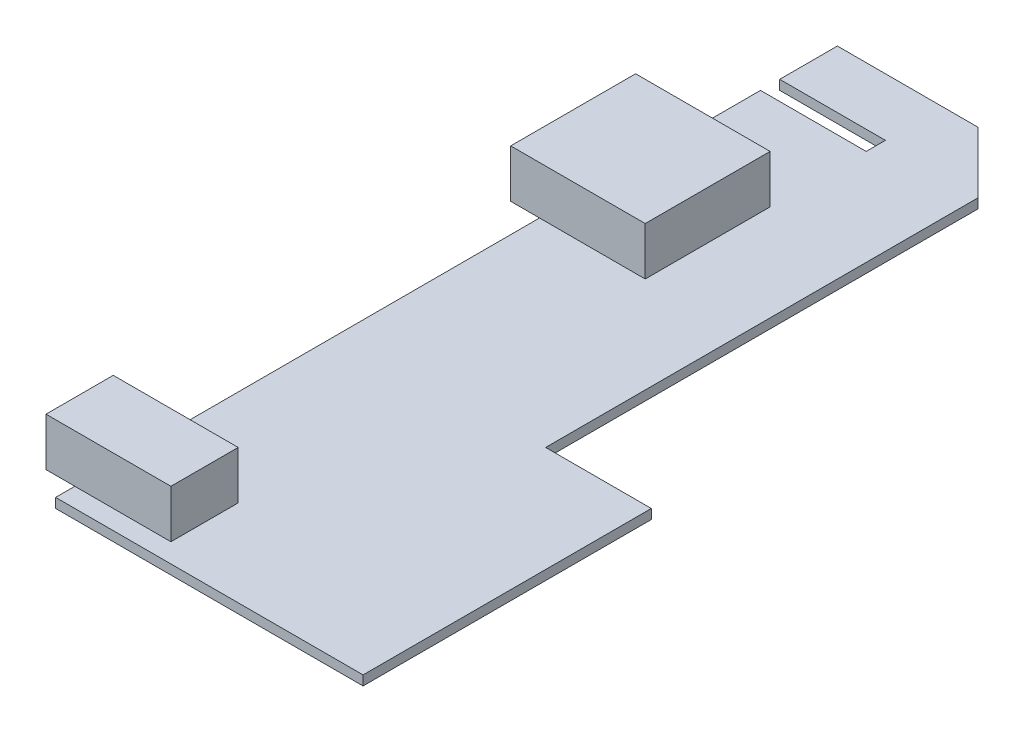
ISO-10303-21;
HEADER;
FILE_DESCRIPTION(('STEP AP214'),'2;1');
FILE_NAME('part.step','',(''),(''),'','','');
FILE_SCHEMA(('AUTOMOTIVE_DESIGN { 1 0 10303 214 1 1 1 1 }'));
ENDSEC;
DATA;
#1=APPLICATION_CONTEXT('core data for automotive mechanical design processes');
#2=APPLICATION_PROTOCOL_DEFINITION('international standard','automotive_design',2000,#1);
#3=PRODUCT_CONTEXT('',#1,'mechanical');
#4=PRODUCT('Part','Part','',(#3));
#5=PRODUCT_RELATED_PRODUCT_CATEGORY('part','',(#4));
#6=PRODUCT_DEFINITION_FORMATION('','',#4);
#7=PRODUCT_DEFINITION_CONTEXT('part definition',#1,'design');
#8=PRODUCT_DEFINITION('design','',#6,#7);
#9=PRODUCT_DEFINITION_SHAPE('','',#8);
#10=(LENGTH_UNIT() NAMED_UNIT(*) SI_UNIT(.MILLI.,.METRE.));
#11=(NAMED_UNIT(*) PLANE_ANGLE_UNIT() SI_UNIT($,.RADIAN.));
#12=(NAMED_UNIT(*) SI_UNIT($,.STERADIAN.) SOLID_ANGLE_UNIT());
#13=UNCERTAINTY_MEASURE_WITH_UNIT(LENGTH_MEASURE(1.E-05),#10,'distance_accuracy_value','');
#14=(GEOMETRIC_REPRESENTATION_CONTEXT(3) GLOBAL_UNCERTAINTY_ASSIGNED_CONTEXT((#13)) GLOBAL_UNIT_ASSIGNED_CONTEXT((#10,
#11,#12)) REPRESENTATION_CONTEXT('',''));
#15=CARTESIAN_POINT('',(0.,0.,0.));
#16=DIRECTION('',(0.,0.,1.));
#17=DIRECTION('',(1.,0.,0.));
#18=AXIS2_PLACEMENT_3D('',#15,#16,#17);
#19=CARTESIAN_POINT('',(0.,1.,0.));
#20=DIRECTION('',(0.,1.,0.));
#21=DIRECTION('',(0.,0.,1.));
#22=AXIS2_PLACEMENT_3D('',#19,#20,#21);
#23=PLANE('',#22);
#24=DIRECTION('',(0.,0.,1.));
#25=VECTOR('',#24,1.);
#26=CARTESIAN_POINT('',(0.,1.,-73.3639610306789));
#27=LINE('',#26,#25);
#28=CARTESIAN_POINT('',(0.,1.,-73.3639610306789));
#29=VERTEX_POINT('',#28);
#30=CARTESIAN_POINT('',(0.,1.,-63.3639610306789));
#31=VERTEX_POINT('',#30);
#32=EDGE_CURVE('E237',#29,#31,#27,.T.);
#33=ORIENTED_EDGE('',*,*,#32,.T.);
#34=DIRECTION('',(-1.,0.,0.));
#35=VECTOR('',#34,1.);
#36=CARTESIAN_POINT('',(-3.00000000000001,1.,-63.3639610306789));
#37=LINE('',#36,#35);
#38=CARTESIAN_POINT('',(11.,1.,-63.3639610306789));
#39=VERTEX_POINT('',#38);
#40=EDGE_CURVE('E434',#39,#31,#37,.T.);
#41=ORIENTED_EDGE('',*,*,#40,.F.);
#42=DIRECTION('',(0.,0.,-1.));
#43=VECTOR('',#42,1.);
#44=CARTESIAN_POINT('',(11.,1.,-50.3639610306789));
#45=LINE('',#44,#43);
#46=CARTESIAN_POINT('',(11.,1.,-50.3639610306789));
#47=VERTEX_POINT('',#46);
#48=EDGE_CURVE('E195',#47,#39,#45,.T.);
#49=ORIENTED_EDGE('',*,*,#48,.F.);
#50=DIRECTION('',(-1.,0.,0.));
#51=VECTOR('',#50,1.);
#52=CARTESIAN_POINT('',(0.,1.,-50.3639610306789));
#53=LINE('',#52,#51);
#54=CARTESIAN_POINT('',(0.,1.,-50.3639610306789));
#55=VERTEX_POINT('',#54);
#56=EDGE_CURVE('E11',#47,#55,#53,.T.);
#57=ORIENTED_EDGE('',*,*,#56,.T.);
#58=CARTESIAN_POINT('',(0.,1.,-9.00000000000001));
#59=VERTEX_POINT('',#58);
#60=EDGE_CURVE('E242',#55,#59,#27,.T.);
#61=ORIENTED_EDGE('',*,*,#60,.T.);
#62=DIRECTION('',(-1.,0.,0.));
#63=VECTOR('',#62,1.);
#64=CARTESIAN_POINT('',(-3.,1.,-9.));
#65=LINE('',#64,#63);
#66=CARTESIAN_POINT('',(10.,1.,-9.));
#67=VERTEX_POINT('',#66);
#68=EDGE_CURVE('E56',#67,#59,#65,.T.);
#69=ORIENTED_EDGE('',*,*,#68,.F.);
#70=DIRECTION('',(0.,0.,-1.));
#71=VECTOR('',#70,1.);
#72=CARTESIAN_POINT('',(10.,1.,-9.));
#73=LINE('',#72,#71);
#74=CARTESIAN_POINT('',(10.,1.,-2.));
#75=VERTEX_POINT('',#74);
#76=EDGE_CURVE('E221',#75,#67,#73,.T.);
#77=ORIENTED_EDGE('',*,*,#76,.F.);
#78=DIRECTION('',(1.,0.,0.));
#79=VECTOR('',#78,1.);
#80=CARTESIAN_POINT('',(10.,1.,-2.));
#81=LINE('',#80,#79);
#82=CARTESIAN_POINT('',(0.,1.,-2.));
#83=VERTEX_POINT('',#82);
#84=EDGE_CURVE('E41',#83,#75,#81,.T.);
#85=ORIENTED_EDGE('',*,*,#84,.F.);
#86=CARTESIAN_POINT('',(0.,1.,0.));
#87=VERTEX_POINT('',#86);
#88=EDGE_CURVE('E286',#83,#87,#27,.T.);
#89=ORIENTED_EDGE('',*,*,#88,.T.);
#90=DIRECTION('',(1.,0.,0.));
#91=VECTOR('',#90,1.);
#92=CARTESIAN_POINT('',(0.,1.,0.));
#93=LINE('',#92,#91);
#94=CARTESIAN_POINT('',(32.,1.,0.));
#95=VERTEX_POINT('',#94);
#96=EDGE_CURVE('E240',#87,#95,#93,.T.);
#97=ORIENTED_EDGE('',*,*,#96,.T.);
#98=DIRECTION('',(0.,0.,-1.));
#99=VECTOR('',#98,1.);
#100=CARTESIAN_POINT('',(32.,1.,0.));
#101=LINE('',#100,#99);
#102=CARTESIAN_POINT('',(32.,1.,-30.));
#103=VERTEX_POINT('',#102);
#104=EDGE_CURVE('E245',#95,#103,#101,.T.);
#105=ORIENTED_EDGE('',*,*,#104,.T.);
#106=DIRECTION('',(-1.,0.,0.));
#107=VECTOR('',#106,1.);
#108=CARTESIAN_POINT('',(32.,1.,-30.));
#109=LINE('',#108,#107);
#110=CARTESIAN_POINT('',(21.,1.,-30.));
#111=VERTEX_POINT('',#110);
#112=EDGE_CURVE('E247',#103,#111,#109,.T.);
#113=ORIENTED_EDGE('',*,*,#112,.T.);
#114=DIRECTION('',(0.,0.,-1.));
#115=VECTOR('',#114,1.);
#116=CARTESIAN_POINT('',(21.,1.,-30.));
#117=LINE('',#116,#115);
#118=CARTESIAN_POINT('',(21.,1.,-75.));
#119=VERTEX_POINT('',#118);
#120=EDGE_CURVE('E249',#111,#119,#117,.T.);
#121=ORIENTED_EDGE('',*,*,#120,.T.);
#122=DIRECTION('',(-0.707106781186548,0.,-0.707106781186547));
#123=VECTOR('',#122,1.);
#124=CARTESIAN_POINT('',(21.,1.,-75.));
#125=LINE('',#124,#123);
#126=CARTESIAN_POINT('',(14.6360389693211,1.,-81.3639610306789));
#127=VERTEX_POINT('',#126);
#128=EDGE_CURVE('E251',#119,#127,#125,.T.);
#129=ORIENTED_EDGE('',*,*,#128,.T.);
#130=DIRECTION('',(-1.,0.,0.));
#131=VECTOR('',#130,1.);
#132=CARTESIAN_POINT('',(14.6360389693211,1.,-81.3639610306789));
#133=LINE('',#132,#131);
#134=CARTESIAN_POINT('',(0.,1.,-81.3639610306789));
#135=VERTEX_POINT('',#134);
#136=EDGE_CURVE('E253',#127,#135,#133,.T.);
#137=ORIENTED_EDGE('',*,*,#136,.T.);
#138=DIRECTION('',(0.,0.,1.));
#139=VECTOR('',#138,1.);
#140=CARTESIAN_POINT('',(0.,1.,-81.3639610306789));
#141=LINE('',#140,#139);
#142=CARTESIAN_POINT('',(0.,1.,-75.3639610306789));
#143=VERTEX_POINT('',#142);
#144=EDGE_CURVE('E255',#135,#143,#141,.T.);
#145=ORIENTED_EDGE('',*,*,#144,.T.);
#146=DIRECTION('',(1.,0.,0.));
#147=VECTOR('',#146,1.);
#148=CARTESIAN_POINT('',(0.,1.,-75.3639610306789));
#149=LINE('',#148,#147);
#150=CARTESIAN_POINT('',(11.,1.,-75.3639610306789));
#151=VERTEX_POINT('',#150);
#152=EDGE_CURVE('E257',#143,#151,#149,.T.);
#153=ORIENTED_EDGE('',*,*,#152,.T.);
#154=DIRECTION('',(0.,0.,1.));
#155=VECTOR('',#154,1.);
#156=CARTESIAN_POINT('',(11.,1.,-75.3639610306789));
#157=LINE('',#156,#155);
#158=CARTESIAN_POINT('',(11.,1.,-73.3639610306789));
#159=VERTEX_POINT('',#158);
#160=EDGE_CURVE('E259',#151,#159,#157,.T.);
#161=ORIENTED_EDGE('',*,*,#160,.T.);
#162=DIRECTION('',(-1.,0.,0.));
#163=VECTOR('',#162,1.);
#164=CARTESIAN_POINT('',(11.,1.,-73.3639610306789));
#165=LINE('',#164,#163);
#166=EDGE_CURVE('E261',#159,#29,#165,.T.);
#167=ORIENTED_EDGE('',*,*,#166,.T.);
#168=EDGE_LOOP('',(#33,#41,#49,#57,#61,#69,#77,#85,#89,#97,#105,#113,#121,#129,#137,#145,#153,
#161,#167));
#169=FACE_BOUND('',#168,.T.);
#170=ADVANCED_FACE('F33',(#169),#23,.T.);
#171=CARTESIAN_POINT('',(0.,1.,-73.3639610306789));
#172=DIRECTION('',(1.,0.,0.));
#173=DIRECTION('',(0.,0.,-1.));
#174=AXIS2_PLACEMENT_3D('',#171,#172,#173);
#175=PLANE('',#174);
#176=DIRECTION('',(0.,0.,1.));
#177=VECTOR('',#176,1.);
#178=CARTESIAN_POINT('',(0.,0.,-73.3639610306789));
#179=LINE('',#178,#177);
#180=CARTESIAN_POINT('',(0.,0.,-73.3639610306789));
#181=VERTEX_POINT('',#180);
#182=CARTESIAN_POINT('',(0.,0.,0.));
#183=VERTEX_POINT('',#182);
#184=EDGE_CURVE('E236',#181,#183,#179,.T.);
#185=ORIENTED_EDGE('',*,*,#184,.T.);
#186=DIRECTION('',(0.,-1.,0.));
#187=VECTOR('',#186,1.);
#188=CARTESIAN_POINT('',(0.,1.,0.));
#189=LINE('',#188,#187);
#190=EDGE_CURVE('E315',#87,#183,#189,.T.);
#191=ORIENTED_EDGE('',*,*,#190,.F.);
#192=ORIENTED_EDGE('',*,*,#88,.F.);
#193=EDGE_CURVE('E243',#59,#83,#27,.T.);
#194=ORIENTED_EDGE('',*,*,#193,.F.);
#195=ORIENTED_EDGE('',*,*,#60,.F.);
#196=EDGE_CURVE('E241',#31,#55,#27,.T.);
#197=ORIENTED_EDGE('',*,*,#196,.F.);
#198=ORIENTED_EDGE('',*,*,#32,.F.);
#199=DIRECTION('',(0.,-1.,0.));
#200=VECTOR('',#199,1.);
#201=CARTESIAN_POINT('',(0.,1.,-73.3639610306789));
#202=LINE('',#201,#200);
#203=EDGE_CURVE('E263',#29,#181,#202,.T.);
#204=ORIENTED_EDGE('',*,*,#203,.T.);
#205=EDGE_LOOP('',(#185,#191,#192,#194,#195,#197,#198,#204));
#206=FACE_BOUND('',#205,.T.);
#207=ADVANCED_FACE('F35',(#206),#175,.F.);
#208=CARTESIAN_POINT('',(0.,1.,0.));
#209=DIRECTION('',(0.,0.,-1.));
#210=DIRECTION('',(-1.,0.,0.));
#211=AXIS2_PLACEMENT_3D('',#208,#209,#210);
#212=PLANE('',#211);
#213=DIRECTION('',(1.,0.,0.));
#214=VECTOR('',#213,1.);
#215=CARTESIAN_POINT('',(0.,0.,0.));
#216=LINE('',#215,#214);
#217=CARTESIAN_POINT('',(32.,0.,0.));
#218=VERTEX_POINT('',#217);
#219=EDGE_CURVE('E266',#183,#218,#216,.T.);
#220=ORIENTED_EDGE('',*,*,#219,.T.);
#221=DIRECTION('',(0.,-1.,0.));
#222=VECTOR('',#221,1.);
#223=CARTESIAN_POINT('',(32.,1.,0.));
#224=LINE('',#223,#222);
#225=EDGE_CURVE('E313',#95,#218,#224,.T.);
#226=ORIENTED_EDGE('',*,*,#225,.F.);
#227=ORIENTED_EDGE('',*,*,#96,.F.);
#228=ORIENTED_EDGE('',*,*,#190,.T.);
#229=EDGE_LOOP('',(#220,#226,#227,#228));
#230=FACE_BOUND('',#229,.T.);
#231=ADVANCED_FACE('F360',(#230),#212,.F.);
#232=CARTESIAN_POINT('',(32.,1.,0.));
#233=DIRECTION('',(-1.,0.,0.));
#234=DIRECTION('',(0.,0.,1.));
#235=AXIS2_PLACEMENT_3D('',#232,#233,#234);
#236=PLANE('',#235);
#237=DIRECTION('',(0.,0.,-1.));
#238=VECTOR('',#237,1.);
#239=CARTESIAN_POINT('',(32.,0.,0.));
#240=LINE('',#239,#238);
#241=CARTESIAN_POINT('',(32.,0.,-30.));
#242=VERTEX_POINT('',#241);
#243=EDGE_CURVE('E268',#218,#242,#240,.T.);
#244=ORIENTED_EDGE('',*,*,#243,.T.);
#245=DIRECTION('',(0.,-1.,0.));
#246=VECTOR('',#245,1.);
#247=CARTESIAN_POINT('',(32.,1.,-30.));
#248=LINE('',#247,#246);
#249=EDGE_CURVE('E310',#103,#242,#248,.T.);
#250=ORIENTED_EDGE('',*,*,#249,.F.);
#251=ORIENTED_EDGE('',*,*,#104,.F.);
#252=ORIENTED_EDGE('',*,*,#225,.T.);
#253=EDGE_LOOP('',(#244,#250,#251,#252));
#254=FACE_BOUND('',#253,.T.);
#255=ADVANCED_FACE('F365',(#254),#236,.F.);
#256=CARTESIAN_POINT('',(32.,1.,-30.));
#257=DIRECTION('',(0.,0.,1.));
#258=DIRECTION('',(1.,0.,0.));
#259=AXIS2_PLACEMENT_3D('',#256,#257,#258);
#260=PLANE('',#259);
#261=DIRECTION('',(-1.,0.,0.));
#262=VECTOR('',#261,1.);
#263=CARTESIAN_POINT('',(32.,0.,-30.));
#264=LINE('',#263,#262);
#265=CARTESIAN_POINT('',(21.,0.,-30.));
#266=VERTEX_POINT('',#265);
#267=EDGE_CURVE('E270',#242,#266,#264,.T.);
#268=ORIENTED_EDGE('',*,*,#267,.T.);
#269=DIRECTION('',(0.,-1.,0.));
#270=VECTOR('',#269,1.);
#271=CARTESIAN_POINT('',(21.,1.,-30.));
#272=LINE('',#271,#270);
#273=EDGE_CURVE('E307',#111,#266,#272,.T.);
#274=ORIENTED_EDGE('',*,*,#273,.F.);
#275=ORIENTED_EDGE('',*,*,#112,.F.);
#276=ORIENTED_EDGE('',*,*,#249,.T.);
#277=EDGE_LOOP('',(#268,#274,#275,#276));
#278=FACE_BOUND('',#277,.T.);
#279=ADVANCED_FACE('F403',(#278),#260,.F.);
#280=CARTESIAN_POINT('',(21.,1.,-30.));
#281=DIRECTION('',(-1.,0.,0.));
#282=DIRECTION('',(0.,0.,1.));
#283=AXIS2_PLACEMENT_3D('',#280,#281,#282);
#284=PLANE('',#283);
#285=DIRECTION('',(0.,0.,-1.));
#286=VECTOR('',#285,1.);
#287=CARTESIAN_POINT('',(21.,0.,-30.));
#288=LINE('',#287,#286);
#289=CARTESIAN_POINT('',(21.,0.,-75.));
#290=VERTEX_POINT('',#289);
#291=EDGE_CURVE('E272',#266,#290,#288,.T.);
#292=ORIENTED_EDGE('',*,*,#291,.T.);
#293=DIRECTION('',(0.,-1.,0.));
#294=VECTOR('',#293,1.);
#295=CARTESIAN_POINT('',(21.,1.,-75.));
#296=LINE('',#295,#294);
#297=EDGE_CURVE('E304',#119,#290,#296,.T.);
#298=ORIENTED_EDGE('',*,*,#297,.F.);
#299=ORIENTED_EDGE('',*,*,#120,.F.);
#300=ORIENTED_EDGE('',*,*,#273,.T.);
#301=EDGE_LOOP('',(#292,#298,#299,#300));
#302=FACE_BOUND('',#301,.T.);
#303=ADVANCED_FACE('F399',(#302),#284,.F.);
#304=CARTESIAN_POINT('',(21.,1.,-75.));
#305=DIRECTION('',(-0.707106781186547,0.,0.707106781186548));
#306=DIRECTION('',(0.707106781186548,0.,0.707106781186547));
#307=AXIS2_PLACEMENT_3D('',#304,#305,#306);
#308=PLANE('',#307);
#309=DIRECTION('',(-0.707106781186548,0.,-0.707106781186547));
#310=VECTOR('',#309,1.);
#311=CARTESIAN_POINT('',(21.,0.,-75.));
#312=LINE('',#311,#310);
#313=CARTESIAN_POINT('',(14.6360389693211,0.,-81.3639610306789));
#314=VERTEX_POINT('',#313);
#315=EDGE_CURVE('E274',#290,#314,#312,.T.);
#316=ORIENTED_EDGE('',*,*,#315,.T.);
#317=DIRECTION('',(0.,-1.,0.));
#318=VECTOR('',#317,1.);
#319=CARTESIAN_POINT('',(14.6360389693211,1.,-81.3639610306789));
#320=LINE('',#319,#318);
#321=EDGE_CURVE('E301',#127,#314,#320,.T.);
#322=ORIENTED_EDGE('',*,*,#321,.F.);
#323=ORIENTED_EDGE('',*,*,#128,.F.);
#324=ORIENTED_EDGE('',*,*,#297,.T.);
#325=EDGE_LOOP('',(#316,#322,#323,#324));
#326=FACE_BOUND('',#325,.T.);
#327=ADVANCED_FACE('F395',(#326),#308,.F.);
#328=CARTESIAN_POINT('',(14.6360389693211,1.,-81.3639610306789));
#329=DIRECTION('',(0.,0.,1.));
#330=DIRECTION('',(1.,0.,0.));
#331=AXIS2_PLACEMENT_3D('',#328,#329,#330);
#332=PLANE('',#331);
#333=DIRECTION('',(-1.,0.,0.));
#334=VECTOR('',#333,1.);
#335=CARTESIAN_POINT('',(14.6360389693211,0.,-81.3639610306789));
#336=LINE('',#335,#334);
#337=CARTESIAN_POINT('',(0.,0.,-81.3639610306789));
#338=VERTEX_POINT('',#337);
#339=EDGE_CURVE('E276',#314,#338,#336,.T.);
#340=ORIENTED_EDGE('',*,*,#339,.T.);
#341=DIRECTION('',(0.,-1.,0.));
#342=VECTOR('',#341,1.);
#343=CARTESIAN_POINT('',(0.,1.,-81.3639610306789));
#344=LINE('',#343,#342);
#345=EDGE_CURVE('E298',#135,#338,#344,.T.);
#346=ORIENTED_EDGE('',*,*,#345,.F.);
#347=ORIENTED_EDGE('',*,*,#136,.F.);
#348=ORIENTED_EDGE('',*,*,#321,.T.);
#349=EDGE_LOOP('',(#340,#346,#347,#348));
#350=FACE_BOUND('',#349,.T.);
#351=ADVANCED_FACE('F391',(#350),#332,.F.);
#352=CARTESIAN_POINT('',(0.,1.,-81.3639610306789));
#353=DIRECTION('',(1.,0.,0.));
#354=DIRECTION('',(0.,0.,-1.));
#355=AXIS2_PLACEMENT_3D('',#352,#353,#354);
#356=PLANE('',#355);
#357=DIRECTION('',(0.,0.,1.));
#358=VECTOR('',#357,1.);
#359=CARTESIAN_POINT('',(0.,0.,-81.3639610306789));
#360=LINE('',#359,#358);
#361=CARTESIAN_POINT('',(0.,0.,-75.3639610306789));
#362=VERTEX_POINT('',#361);
#363=EDGE_CURVE('E278',#338,#362,#360,.T.);
#364=ORIENTED_EDGE('',*,*,#363,.T.);
#365=DIRECTION('',(0.,-1.,0.));
#366=VECTOR('',#365,1.);
#367=CARTESIAN_POINT('',(0.,1.,-75.3639610306789));
#368=LINE('',#367,#366);
#369=EDGE_CURVE('E295',#143,#362,#368,.T.);
#370=ORIENTED_EDGE('',*,*,#369,.F.);
#371=ORIENTED_EDGE('',*,*,#144,.F.);
#372=ORIENTED_EDGE('',*,*,#345,.T.);
#373=EDGE_LOOP('',(#364,#370,#371,#372));
#374=FACE_BOUND('',#373,.T.);
#375=ADVANCED_FACE('F387',(#374),#356,.F.);
#376=CARTESIAN_POINT('',(0.,1.,-75.3639610306789));
#377=DIRECTION('',(0.,0.,-1.));
#378=DIRECTION('',(-1.,0.,0.));
#379=AXIS2_PLACEMENT_3D('',#376,#377,#378);
#380=PLANE('',#379);
#381=DIRECTION('',(1.,0.,0.));
#382=VECTOR('',#381,1.);
#383=CARTESIAN_POINT('',(0.,0.,-75.3639610306789));
#384=LINE('',#383,#382);
#385=CARTESIAN_POINT('',(11.,0.,-75.3639610306789));
#386=VERTEX_POINT('',#385);
#387=EDGE_CURVE('E280',#362,#386,#384,.T.);
#388=ORIENTED_EDGE('',*,*,#387,.T.);
#389=DIRECTION('',(0.,-1.,0.));
#390=VECTOR('',#389,1.);
#391=CARTESIAN_POINT('',(11.,1.,-75.3639610306789));
#392=LINE('',#391,#390);
#393=EDGE_CURVE('E292',#151,#386,#392,.T.);
#394=ORIENTED_EDGE('',*,*,#393,.F.);
#395=ORIENTED_EDGE('',*,*,#152,.F.);
#396=ORIENTED_EDGE('',*,*,#369,.T.);
#397=EDGE_LOOP('',(#388,#394,#395,#396));
#398=FACE_BOUND('',#397,.T.);
#399=ADVANCED_FACE('F383',(#398),#380,.F.);
#400=CARTESIAN_POINT('',(11.,1.,-75.3639610306789));
#401=DIRECTION('',(1.,0.,0.));
#402=DIRECTION('',(0.,0.,-1.));
#403=AXIS2_PLACEMENT_3D('',#400,#401,#402);
#404=PLANE('',#403);
#405=DIRECTION('',(0.,0.,1.));
#406=VECTOR('',#405,1.);
#407=CARTESIAN_POINT('',(11.,0.,-75.3639610306789));
#408=LINE('',#407,#406);
#409=CARTESIAN_POINT('',(11.,0.,-73.3639610306789));
#410=VERTEX_POINT('',#409);
#411=EDGE_CURVE('E282',#386,#410,#408,.T.);
#412=ORIENTED_EDGE('',*,*,#411,.T.);
#413=DIRECTION('',(0.,-1.,0.));
#414=VECTOR('',#413,1.);
#415=CARTESIAN_POINT('',(11.,1.,-73.3639610306789));
#416=LINE('',#415,#414);
#417=EDGE_CURVE('E289',#159,#410,#416,.T.);
#418=ORIENTED_EDGE('',*,*,#417,.F.);
#419=ORIENTED_EDGE('',*,*,#160,.F.);
#420=ORIENTED_EDGE('',*,*,#393,.T.);
#421=EDGE_LOOP('',(#412,#418,#419,#420));
#422=FACE_BOUND('',#421,.T.);
#423=ADVANCED_FACE('F379',(#422),#404,.F.);
#424=CARTESIAN_POINT('',(11.,1.,-73.3639610306789));
#425=DIRECTION('',(0.,0.,1.));
#426=DIRECTION('',(1.,0.,0.));
#427=AXIS2_PLACEMENT_3D('',#424,#425,#426);
#428=PLANE('',#427);
#429=DIRECTION('',(-1.,0.,0.));
#430=VECTOR('',#429,1.);
#431=CARTESIAN_POINT('',(11.,0.,-73.3639610306789));
#432=LINE('',#431,#430);
#433=EDGE_CURVE('E284',#410,#181,#432,.T.);
#434=ORIENTED_EDGE('',*,*,#433,.T.);
#435=ORIENTED_EDGE('',*,*,#203,.F.);
#436=ORIENTED_EDGE('',*,*,#166,.F.);
#437=ORIENTED_EDGE('',*,*,#417,.T.);
#438=EDGE_LOOP('',(#434,#435,#436,#437));
#439=FACE_BOUND('',#438,.T.);
#440=ADVANCED_FACE('F375',(#439),#428,.F.);
#441=CARTESIAN_POINT('',(0.,0.,0.));
#442=DIRECTION('',(0.,1.,0.));
#443=DIRECTION('',(0.,0.,1.));
#444=AXIS2_PLACEMENT_3D('',#441,#442,#443);
#445=PLANE('',#444);
#446=ORIENTED_EDGE('',*,*,#184,.F.);
#447=ORIENTED_EDGE('',*,*,#433,.F.);
#448=ORIENTED_EDGE('',*,*,#411,.F.);
#449=ORIENTED_EDGE('',*,*,#387,.F.);
#450=ORIENTED_EDGE('',*,*,#363,.F.);
#451=ORIENTED_EDGE('',*,*,#339,.F.);
#452=ORIENTED_EDGE('',*,*,#315,.F.);
#453=ORIENTED_EDGE('',*,*,#291,.F.);
#454=ORIENTED_EDGE('',*,*,#267,.F.);
#455=ORIENTED_EDGE('',*,*,#243,.F.);
#456=ORIENTED_EDGE('',*,*,#219,.F.);
#457=EDGE_LOOP('',(#446,#447,#448,#449,#450,#451,#452,#453,#454,#455,#456));
#458=FACE_BOUND('',#457,.T.);
#459=ADVANCED_FACE('F372',(#458),#445,.F.);
#460=CARTESIAN_POINT('',(-3.,6.,-2.));
#461=DIRECTION('',(1.,0.,0.));
#462=DIRECTION('',(0.,0.,-1.));
#463=AXIS2_PLACEMENT_3D('',#460,#461,#462);
#464=PLANE('',#463);
#465=DIRECTION('',(0.,0.,1.));
#466=VECTOR('',#465,1.);
#467=CARTESIAN_POINT('',(-3.,1.,-2.));
#468=LINE('',#467,#466);
#469=CARTESIAN_POINT('',(-3.,1.,-9.));
#470=VERTEX_POINT('',#469);
#471=CARTESIAN_POINT('',(-3.,1.,-2.));
#472=VERTEX_POINT('',#471);
#473=EDGE_CURVE('E201',#470,#472,#468,.T.);
#474=ORIENTED_EDGE('',*,*,#473,.T.);
#475=DIRECTION('',(0.,-1.,0.));
#476=VECTOR('',#475,1.);
#477=CARTESIAN_POINT('',(-3.,6.,-2.));
#478=LINE('',#477,#476);
#479=CARTESIAN_POINT('',(-3.,6.,-2.));
#480=VERTEX_POINT('',#479);
#481=EDGE_CURVE('E233',#480,#472,#478,.T.);
#482=ORIENTED_EDGE('',*,*,#481,.F.);
#483=DIRECTION('',(0.,0.,1.));
#484=VECTOR('',#483,1.);
#485=CARTESIAN_POINT('',(-3.,6.,-2.));
#486=LINE('',#485,#484);
#487=CARTESIAN_POINT('',(-3.,6.,-9.));
#488=VERTEX_POINT('',#487);
#489=EDGE_CURVE('E209',#488,#480,#486,.T.);
#490=ORIENTED_EDGE('',*,*,#489,.F.);
#491=DIRECTION('',(0.,-1.,0.));
#492=VECTOR('',#491,1.);
#493=CARTESIAN_POINT('',(-3.,6.,-9.));
#494=LINE('',#493,#492);
#495=EDGE_CURVE('E217',#488,#470,#494,.T.);
#496=ORIENTED_EDGE('',*,*,#495,.T.);
#497=EDGE_LOOP('',(#474,#482,#490,#496));
#498=FACE_BOUND('',#497,.T.);
#499=ADVANCED_FACE('F337',(#498),#464,.F.);
#500=CARTESIAN_POINT('',(10.,6.,-2.));
#501=DIRECTION('',(0.,0.,-1.));
#502=DIRECTION('',(-1.,0.,0.));
#503=AXIS2_PLACEMENT_3D('',#500,#501,#502);
#504=PLANE('',#503);
#505=EDGE_CURVE('E204',#472,#83,#81,.T.);
#506=ORIENTED_EDGE('',*,*,#505,.T.);
#507=ORIENTED_EDGE('',*,*,#84,.T.);
#508=DIRECTION('',(0.,-1.,0.));
#509=VECTOR('',#508,1.);
#510=CARTESIAN_POINT('',(10.,6.,-2.));
#511=LINE('',#510,#509);
#512=CARTESIAN_POINT('',(10.,6.,-2.));
#513=VERTEX_POINT('',#512);
#514=EDGE_CURVE('E230',#513,#75,#511,.T.);
#515=ORIENTED_EDGE('',*,*,#514,.F.);
#516=DIRECTION('',(1.,0.,0.));
#517=VECTOR('',#516,1.);
#518=CARTESIAN_POINT('',(10.,6.,-2.));
#519=LINE('',#518,#517);
#520=EDGE_CURVE('E212',#480,#513,#519,.T.);
#521=ORIENTED_EDGE('',*,*,#520,.F.);
#522=ORIENTED_EDGE('',*,*,#481,.T.);
#523=EDGE_LOOP('',(#506,#507,#515,#521,#522));
#524=FACE_BOUND('',#523,.T.);
#525=ADVANCED_FACE('F323',(#524),#504,.F.);
#526=CARTESIAN_POINT('',(10.,6.,-9.));
#527=DIRECTION('',(-1.,0.,0.));
#528=DIRECTION('',(0.,0.,1.));
#529=AXIS2_PLACEMENT_3D('',#526,#527,#528);
#530=PLANE('',#529);
#531=ORIENTED_EDGE('',*,*,#76,.T.);
#532=DIRECTION('',(0.,-1.,0.));
#533=VECTOR('',#532,1.);
#534=CARTESIAN_POINT('',(10.,6.,-9.));
#535=LINE('',#534,#533);
#536=CARTESIAN_POINT('',(10.,6.,-9.));
#537=VERTEX_POINT('',#536);
#538=EDGE_CURVE('E227',#537,#67,#535,.T.);
#539=ORIENTED_EDGE('',*,*,#538,.F.);
#540=DIRECTION('',(0.,0.,-1.));
#541=VECTOR('',#540,1.);
#542=CARTESIAN_POINT('',(10.,6.,-9.));
#543=LINE('',#542,#541);
#544=EDGE_CURVE('E214',#513,#537,#543,.T.);
#545=ORIENTED_EDGE('',*,*,#544,.F.);
#546=ORIENTED_EDGE('',*,*,#514,.T.);
#547=EDGE_LOOP('',(#531,#539,#545,#546));
#548=FACE_BOUND('',#547,.T.);
#549=ADVANCED_FACE('F327',(#548),#530,.F.);
#550=CARTESIAN_POINT('',(-3.,6.,-9.));
#551=DIRECTION('',(0.,0.,1.));
#552=DIRECTION('',(1.,0.,0.));
#553=AXIS2_PLACEMENT_3D('',#550,#551,#552);
#554=PLANE('',#553);
#555=ORIENTED_EDGE('',*,*,#68,.T.);
#556=EDGE_CURVE('E223',#59,#470,#65,.T.);
#557=ORIENTED_EDGE('',*,*,#556,.T.);
#558=ORIENTED_EDGE('',*,*,#495,.F.);
#559=DIRECTION('',(-1.,0.,0.));
#560=VECTOR('',#559,1.);
#561=CARTESIAN_POINT('',(-3.,6.,-9.));
#562=LINE('',#561,#560);
#563=EDGE_CURVE('E216',#537,#488,#562,.T.);
#564=ORIENTED_EDGE('',*,*,#563,.F.);
#565=ORIENTED_EDGE('',*,*,#538,.T.);
#566=EDGE_LOOP('',(#555,#557,#558,#564,#565));
#567=FACE_BOUND('',#566,.T.);
#568=ADVANCED_FACE('F465',(#567),#554,.F.);
#569=CARTESIAN_POINT('',(0.,6.,0.));
#570=DIRECTION('',(0.,-1.,0.));
#571=DIRECTION('',(0.,0.,-1.));
#572=AXIS2_PLACEMENT_3D('',#569,#570,#571);
#573=PLANE('',#572);
#574=ORIENTED_EDGE('',*,*,#489,.T.);
#575=ORIENTED_EDGE('',*,*,#520,.T.);
#576=ORIENTED_EDGE('',*,*,#544,.T.);
#577=ORIENTED_EDGE('',*,*,#563,.T.);
#578=EDGE_LOOP('',(#574,#575,#576,#577));
#579=FACE_BOUND('',#578,.T.);
#580=ADVANCED_FACE('F331',(#579),#573,.F.);
#581=CARTESIAN_POINT('',(0.,1.,0.));
#582=DIRECTION('',(0.,-1.,0.));
#583=DIRECTION('',(0.,0.,-1.));
#584=AXIS2_PLACEMENT_3D('',#581,#582,#583);
#585=PLANE('',#584);
#586=ORIENTED_EDGE('',*,*,#556,.F.);
#587=ORIENTED_EDGE('',*,*,#193,.T.);
#588=ORIENTED_EDGE('',*,*,#505,.F.);
#589=ORIENTED_EDGE('',*,*,#473,.F.);
#590=EDGE_LOOP('',(#586,#587,#588,#589));
#591=FACE_BOUND('',#590,.T.);
#592=ADVANCED_FACE('F340',(#591),#585,.T.);
#593=CARTESIAN_POINT('',(0.,1.,0.));
#594=DIRECTION('',(0.,1.,0.));
#595=DIRECTION('',(0.,0.,1.));
#596=AXIS2_PLACEMENT_3D('',#593,#594,#595);
#597=PLANE('',#596);
#598=CARTESIAN_POINT('',(-3.00000000000001,1.,-63.3639610306789));
#599=VERTEX_POINT('',#598);
#600=EDGE_CURVE('E199',#31,#599,#37,.T.);
#601=ORIENTED_EDGE('',*,*,#600,.F.);
#602=ORIENTED_EDGE('',*,*,#196,.T.);
#603=DIRECTION('',(1.,0.,0.));
#604=VECTOR('',#603,1.);
#605=CARTESIAN_POINT('',(-3.00000000000001,1.,-50.3639610306789));
#606=LINE('',#605,#604);
#607=CARTESIAN_POINT('',(-3.00000000000001,1.,-50.3639610306789));
#608=VERTEX_POINT('',#607);
#609=EDGE_CURVE('E350',#608,#55,#606,.T.);
#610=ORIENTED_EDGE('',*,*,#609,.F.);
#611=DIRECTION('',(0.,0.,1.));
#612=VECTOR('',#611,1.);
#613=CARTESIAN_POINT('',(-3.00000000000001,1.,-63.3639610306789));
#614=LINE('',#613,#612);
#615=EDGE_CURVE('E355',#599,#608,#614,.T.);
#616=ORIENTED_EDGE('',*,*,#615,.F.);
#617=EDGE_LOOP('',(#601,#602,#610,#616));
#618=FACE_BOUND('',#617,.T.);
#619=ADVANCED_FACE('F349',(#618),#597,.F.);
#620=CARTESIAN_POINT('',(-3.00000000000001,6.,-63.3639610306789));
#621=DIRECTION('',(0.,0.,1.));
#622=DIRECTION('',(1.,0.,0.));
#623=AXIS2_PLACEMENT_3D('',#620,#621,#622);
#624=PLANE('',#623);
#625=ORIENTED_EDGE('',*,*,#40,.T.);
#626=ORIENTED_EDGE('',*,*,#600,.T.);
#627=DIRECTION('',(0.,-1.,0.));
#628=VECTOR('',#627,1.);
#629=CARTESIAN_POINT('',(-3.00000000000001,6.,-63.3639610306789));
#630=LINE('',#629,#628);
#631=CARTESIAN_POINT('',(-3.00000000000001,6.,-63.3639610306789));
#632=VERTEX_POINT('',#631);
#633=EDGE_CURVE('E181',#632,#599,#630,.T.);
#634=ORIENTED_EDGE('',*,*,#633,.F.);
#635=DIRECTION('',(-1.,0.,0.));
#636=VECTOR('',#635,1.);
#637=CARTESIAN_POINT('',(-3.00000000000001,6.,-63.3639610306789));
#638=LINE('',#637,#636);
#639=CARTESIAN_POINT('',(11.,6.,-63.3639610306789));
#640=VERTEX_POINT('',#639);
#641=EDGE_CURVE('E187',#640,#632,#638,.T.);
#642=ORIENTED_EDGE('',*,*,#641,.F.);
#643=DIRECTION('',(0.,-1.,0.));
#644=VECTOR('',#643,1.);
#645=CARTESIAN_POINT('',(11.,6.,-63.3639610306789));
#646=LINE('',#645,#644);
#647=EDGE_CURVE('E447',#640,#39,#646,.T.);
#648=ORIENTED_EDGE('',*,*,#647,.T.);
#649=EDGE_LOOP('',(#625,#626,#634,#642,#648));
#650=FACE_BOUND('',#649,.T.);
#651=ADVANCED_FACE('F198',(#650),#624,.F.);
#652=CARTESIAN_POINT('',(-3.00000000000001,6.,-63.3639610306789));
#653=DIRECTION('',(1.,0.,0.));
#654=DIRECTION('',(0.,0.,-1.));
#655=AXIS2_PLACEMENT_3D('',#652,#653,#654);
#656=PLANE('',#655);
#657=ORIENTED_EDGE('',*,*,#615,.T.);
#658=DIRECTION('',(0.,-1.,0.));
#659=VECTOR('',#658,1.);
#660=CARTESIAN_POINT('',(-3.00000000000001,6.,-50.3639610306789));
#661=LINE('',#660,#659);
#662=CARTESIAN_POINT('',(-3.00000000000001,6.,-50.3639610306789));
#663=VERTEX_POINT('',#662);
#664=EDGE_CURVE('E183',#663,#608,#661,.T.);
#665=ORIENTED_EDGE('',*,*,#664,.F.);
#666=DIRECTION('',(0.,0.,1.));
#667=VECTOR('',#666,1.);
#668=CARTESIAN_POINT('',(-3.00000000000001,6.,-63.3639610306789));
#669=LINE('',#668,#667);
#670=EDGE_CURVE('E177',#632,#663,#669,.T.);
#671=ORIENTED_EDGE('',*,*,#670,.F.);
#672=ORIENTED_EDGE('',*,*,#633,.T.);
#673=EDGE_LOOP('',(#657,#665,#671,#672));
#674=FACE_BOUND('',#673,.T.);
#675=ADVANCED_FACE('F179',(#674),#656,.F.);
#676=CARTESIAN_POINT('',(-3.00000000000001,6.,-50.3639610306789));
#677=DIRECTION('',(0.,0.,-1.));
#678=DIRECTION('',(-1.,0.,0.));
#679=AXIS2_PLACEMENT_3D('',#676,#677,#678);
#680=PLANE('',#679);
#681=ORIENTED_EDGE('',*,*,#609,.T.);
#682=ORIENTED_EDGE('',*,*,#56,.F.);
#683=DIRECTION('',(0.,-1.,0.));
#684=VECTOR('',#683,1.);
#685=CARTESIAN_POINT('',(11.,6.,-50.3639610306789));
#686=LINE('',#685,#684);
#687=CARTESIAN_POINT('',(11.,6.,-50.3639610306789));
#688=VERTEX_POINT('',#687);
#689=EDGE_CURVE('E48',#688,#47,#686,.T.);
#690=ORIENTED_EDGE('',*,*,#689,.F.);
#691=DIRECTION('',(1.,0.,0.));
#692=VECTOR('',#691,1.);
#693=CARTESIAN_POINT('',(-3.00000000000001,6.,-50.3639610306789));
#694=LINE('',#693,#692);
#695=EDGE_CURVE('E186',#663,#688,#694,.T.);
#696=ORIENTED_EDGE('',*,*,#695,.F.);
#697=ORIENTED_EDGE('',*,*,#664,.T.);
#698=EDGE_LOOP('',(#681,#682,#690,#696,#697));
#699=FACE_BOUND('',#698,.T.);
#700=ADVANCED_FACE('F353',(#699),#680,.F.);
#701=CARTESIAN_POINT('',(11.,6.,-50.3639610306789));
#702=DIRECTION('',(-1.,0.,0.));
#703=DIRECTION('',(0.,0.,1.));
#704=AXIS2_PLACEMENT_3D('',#701,#702,#703);
#705=PLANE('',#704);
#706=ORIENTED_EDGE('',*,*,#48,.T.);
#707=ORIENTED_EDGE('',*,*,#647,.F.);
#708=DIRECTION('',(0.,0.,-1.));
#709=VECTOR('',#708,1.);
#710=CARTESIAN_POINT('',(11.,6.,-50.3639610306789));
#711=LINE('',#710,#709);
#712=EDGE_CURVE('E191',#688,#640,#711,.T.);
#713=ORIENTED_EDGE('',*,*,#712,.F.);
#714=ORIENTED_EDGE('',*,*,#689,.T.);
#715=EDGE_LOOP('',(#706,#707,#713,#714));
#716=FACE_BOUND('',#715,.T.);
#717=ADVANCED_FACE('F448',(#716),#705,.F.);
#718=CARTESIAN_POINT('',(0.,6.,0.));
#719=DIRECTION('',(0.,1.,0.));
#720=DIRECTION('',(0.,0.,1.));
#721=AXIS2_PLACEMENT_3D('',#718,#719,#720);
#722=PLANE('',#721);
#723=ORIENTED_EDGE('',*,*,#641,.T.);
#724=ORIENTED_EDGE('',*,*,#670,.T.);
#725=ORIENTED_EDGE('',*,*,#695,.T.);
#726=ORIENTED_EDGE('',*,*,#712,.T.);
#727=EDGE_LOOP('',(#723,#724,#725,#726));
#728=FACE_BOUND('',#727,.T.);
#729=ADVANCED_FACE('F190',(#728),#722,.T.);
#730=CLOSED_SHELL('',(#170,#207,#231,#255,#279,#303,#327,#351,#375,#399,#423,#440,#459,#499,
#525,#549,#568,#580,#592,#619,#651,#675,#700,#717,#729));
#731=MANIFOLD_SOLID_BREP('B2',#730);
#732=ADVANCED_BREP_SHAPE_REPRESENTATION('',(#18,#731),#14);
#733=SHAPE_DEFINITION_REPRESENTATION(#9,#732);
ENDSEC;
END-ISO-10303-21;
